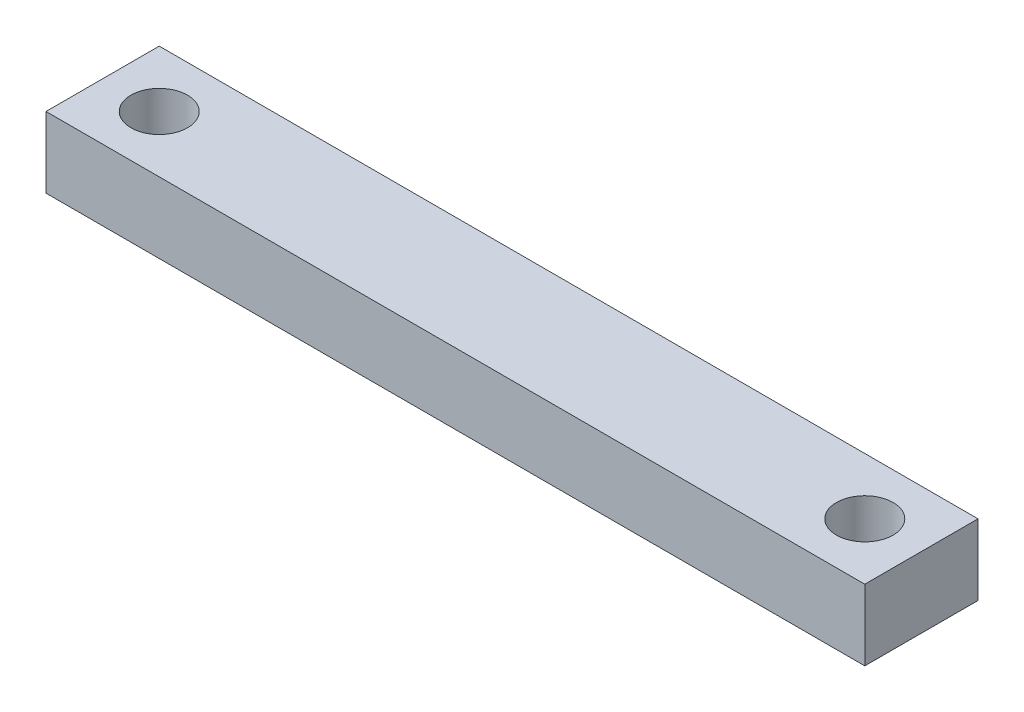
ISO-10303-21;
HEADER;
FILE_DESCRIPTION(('STEP AP214'),'2;1');
FILE_NAME('part.step','',(''),(''),'','','');
FILE_SCHEMA(('AUTOMOTIVE_DESIGN { 1 0 10303 214 1 1 1 1 }'));
ENDSEC;
DATA;
#1=APPLICATION_CONTEXT('core data for automotive mechanical design processes');
#2=APPLICATION_PROTOCOL_DEFINITION('international standard','automotive_design',2000,#1);
#3=PRODUCT_CONTEXT('',#1,'mechanical');
#4=PRODUCT('Part','Part','',(#3));
#5=PRODUCT_RELATED_PRODUCT_CATEGORY('part','',(#4));
#6=PRODUCT_DEFINITION_FORMATION('','',#4);
#7=PRODUCT_DEFINITION_CONTEXT('part definition',#1,'design');
#8=PRODUCT_DEFINITION('design','',#6,#7);
#9=PRODUCT_DEFINITION_SHAPE('','',#8);
#10=(LENGTH_UNIT() NAMED_UNIT(*) SI_UNIT(.MILLI.,.METRE.));
#11=(NAMED_UNIT(*) PLANE_ANGLE_UNIT() SI_UNIT($,.RADIAN.));
#12=(NAMED_UNIT(*) SI_UNIT($,.STERADIAN.) SOLID_ANGLE_UNIT());
#13=UNCERTAINTY_MEASURE_WITH_UNIT(LENGTH_MEASURE(1.E-05),#10,'distance_accuracy_value','');
#14=(GEOMETRIC_REPRESENTATION_CONTEXT(3) GLOBAL_UNCERTAINTY_ASSIGNED_CONTEXT((#13)) GLOBAL_UNIT_ASSIGNED_CONTEXT((#10,
#11,#12)) REPRESENTATION_CONTEXT('',''));
#15=CARTESIAN_POINT('',(0.,0.,0.));
#16=DIRECTION('',(0.,0.,1.));
#17=DIRECTION('',(1.,0.,0.));
#18=AXIS2_PLACEMENT_3D('',#15,#16,#17);
#19=CARTESIAN_POINT('',(0.,5.,0.));
#20=DIRECTION('',(0.,-1.,0.));
#21=DIRECTION('',(0.,0.,-1.));
#22=AXIS2_PLACEMENT_3D('',#19,#20,#21);
#23=PLANE('',#22);
#24=DIRECTION('',(0.,0.,1.));
#25=VECTOR('',#24,1.);
#26=CARTESIAN_POINT('',(0.,5.,0.));
#27=LINE('',#26,#25);
#28=CARTESIAN_POINT('',(0.,5.,-8.));
#29=VERTEX_POINT('',#28);
#30=CARTESIAN_POINT('',(0.,5.,0.));
#31=VERTEX_POINT('',#30);
#32=EDGE_CURVE('E89',#29,#31,#27,.T.);
#33=ORIENTED_EDGE('',*,*,#32,.T.);
#34=DIRECTION('',(1.,0.,0.));
#35=VECTOR('',#34,1.);
#36=CARTESIAN_POINT('',(0.,5.,0.));
#37=LINE('',#36,#35);
#38=CARTESIAN_POINT('',(57.85,5.,0.));
#39=VERTEX_POINT('',#38);
#40=EDGE_CURVE('E84',#31,#39,#37,.T.);
#41=ORIENTED_EDGE('',*,*,#40,.T.);
#42=DIRECTION('',(0.,0.,-1.));
#43=VECTOR('',#42,1.);
#44=CARTESIAN_POINT('',(57.85,5.,0.));
#45=LINE('',#44,#43);
#46=CARTESIAN_POINT('',(57.85,5.,-8.));
#47=VERTEX_POINT('',#46);
#48=EDGE_CURVE('E87',#39,#47,#45,.T.);
#49=ORIENTED_EDGE('',*,*,#48,.T.);
#50=DIRECTION('',(-1.,0.,0.));
#51=VECTOR('',#50,1.);
#52=CARTESIAN_POINT('',(0.,5.,-8.));
#53=LINE('',#52,#51);
#54=EDGE_CURVE('E54',#47,#29,#53,.T.);
#55=ORIENTED_EDGE('',*,*,#54,.T.);
#56=EDGE_LOOP('',(#33,#41,#49,#55));
#57=FACE_BOUND('',#56,.T.);
#58=CARTESIAN_POINT('',(4.,5.,-4.));
#59=DIRECTION('',(0.,1.,0.));
#60=DIRECTION('',(0.,0.,1.));
#61=AXIS2_PLACEMENT_3D('',#58,#59,#60);
#62=CIRCLE('',#61,2.);
#63=CARTESIAN_POINT('',(4.,5.,-2.));
#64=VERTEX_POINT('',#63);
#65=EDGE_CURVE('E104',#64,#64,#62,.T.);
#66=ORIENTED_EDGE('',*,*,#65,.F.);
#67=EDGE_LOOP('',(#66));
#68=FACE_BOUND('',#67,.T.);
#69=CARTESIAN_POINT('',(53.85,5.,-4.));
#70=DIRECTION('',(0.,1.,0.));
#71=DIRECTION('',(0.,0.,1.));
#72=AXIS2_PLACEMENT_3D('',#69,#70,#71);
#73=CIRCLE('',#72,2.);
#74=CARTESIAN_POINT('',(53.85,5.,-2.));
#75=VERTEX_POINT('',#74);
#76=EDGE_CURVE('E119',#75,#75,#73,.T.);
#77=ORIENTED_EDGE('',*,*,#76,.F.);
#78=EDGE_LOOP('',(#77));
#79=FACE_BOUND('',#78,.T.);
#80=ADVANCED_FACE('F37',(#57,#68,#79),#23,.F.);
#81=CARTESIAN_POINT('',(0.,0.,0.));
#82=DIRECTION('',(0.,-1.,0.));
#83=DIRECTION('',(0.,0.,-1.));
#84=AXIS2_PLACEMENT_3D('',#81,#82,#83);
#85=PLANE('',#84);
#86=CARTESIAN_POINT('',(4.,0.,-4.));
#87=DIRECTION('',(0.,1.,0.));
#88=DIRECTION('',(0.,0.,1.));
#89=AXIS2_PLACEMENT_3D('',#86,#87,#88);
#90=CIRCLE('',#89,2.);
#91=CARTESIAN_POINT('',(4.,0.,-2.));
#92=VERTEX_POINT('',#91);
#93=EDGE_CURVE('E116',#92,#92,#90,.T.);
#94=ORIENTED_EDGE('',*,*,#93,.T.);
#95=EDGE_LOOP('',(#94));
#96=FACE_BOUND('',#95,.T.);
#97=DIRECTION('',(0.,0.,1.));
#98=VECTOR('',#97,1.);
#99=CARTESIAN_POINT('',(0.,0.,0.));
#100=LINE('',#99,#98);
#101=CARTESIAN_POINT('',(0.,0.,-8.));
#102=VERTEX_POINT('',#101);
#103=CARTESIAN_POINT('',(0.,0.,0.));
#104=VERTEX_POINT('',#103);
#105=EDGE_CURVE('E101',#102,#104,#100,.T.);
#106=ORIENTED_EDGE('',*,*,#105,.F.);
#107=DIRECTION('',(-1.,0.,0.));
#108=VECTOR('',#107,1.);
#109=CARTESIAN_POINT('',(0.,0.,-8.));
#110=LINE('',#109,#108);
#111=CARTESIAN_POINT('',(57.85,0.,-8.));
#112=VERTEX_POINT('',#111);
#113=EDGE_CURVE('E77',#112,#102,#110,.T.);
#114=ORIENTED_EDGE('',*,*,#113,.F.);
#115=DIRECTION('',(0.,0.,-1.));
#116=VECTOR('',#115,1.);
#117=CARTESIAN_POINT('',(57.85,0.,0.));
#118=LINE('',#117,#116);
#119=CARTESIAN_POINT('',(57.85,0.,0.));
#120=VERTEX_POINT('',#119);
#121=EDGE_CURVE('E71',#120,#112,#118,.T.);
#122=ORIENTED_EDGE('',*,*,#121,.F.);
#123=DIRECTION('',(1.,0.,0.));
#124=VECTOR('',#123,1.);
#125=CARTESIAN_POINT('',(0.,0.,0.));
#126=LINE('',#125,#124);
#127=EDGE_CURVE('E93',#104,#120,#126,.T.);
#128=ORIENTED_EDGE('',*,*,#127,.F.);
#129=EDGE_LOOP('',(#106,#114,#122,#128));
#130=FACE_BOUND('',#129,.T.);
#131=CARTESIAN_POINT('',(53.85,0.,-4.));
#132=DIRECTION('',(0.,1.,0.));
#133=DIRECTION('',(0.,0.,1.));
#134=AXIS2_PLACEMENT_3D('',#131,#132,#133);
#135=CIRCLE('',#134,2.);
#136=CARTESIAN_POINT('',(53.85,0.,-2.));
#137=VERTEX_POINT('',#136);
#138=EDGE_CURVE('E122',#137,#137,#135,.T.);
#139=ORIENTED_EDGE('',*,*,#138,.T.);
#140=EDGE_LOOP('',(#139));
#141=FACE_BOUND('',#140,.T.);
#142=ADVANCED_FACE('F112',(#96,#130,#141),#85,.T.);
#143=CARTESIAN_POINT('',(0.,5.,0.));
#144=DIRECTION('',(1.,0.,0.));
#145=DIRECTION('',(0.,0.,-1.));
#146=AXIS2_PLACEMENT_3D('',#143,#144,#145);
#147=PLANE('',#146);
#148=ORIENTED_EDGE('',*,*,#105,.T.);
#149=DIRECTION('',(0.,-1.,0.));
#150=VECTOR('',#149,1.);
#151=CARTESIAN_POINT('',(0.,5.,0.));
#152=LINE('',#151,#150);
#153=EDGE_CURVE('E11',#31,#104,#152,.T.);
#154=ORIENTED_EDGE('',*,*,#153,.F.);
#155=ORIENTED_EDGE('',*,*,#32,.F.);
#156=DIRECTION('',(0.,-1.,0.));
#157=VECTOR('',#156,1.);
#158=CARTESIAN_POINT('',(0.,5.,-8.));
#159=LINE('',#158,#157);
#160=EDGE_CURVE('E97',#29,#102,#159,.T.);
#161=ORIENTED_EDGE('',*,*,#160,.T.);
#162=EDGE_LOOP('',(#148,#154,#155,#161));
#163=FACE_BOUND('',#162,.T.);
#164=ADVANCED_FACE('F39',(#163),#147,.F.);
#165=CARTESIAN_POINT('',(0.,5.,0.));
#166=DIRECTION('',(0.,0.,-1.));
#167=DIRECTION('',(-1.,0.,0.));
#168=AXIS2_PLACEMENT_3D('',#165,#166,#167);
#169=PLANE('',#168);
#170=ORIENTED_EDGE('',*,*,#127,.T.);
#171=DIRECTION('',(0.,-1.,0.));
#172=VECTOR('',#171,1.);
#173=CARTESIAN_POINT('',(57.85,5.,0.));
#174=LINE('',#173,#172);
#175=EDGE_CURVE('E46',#39,#120,#174,.T.);
#176=ORIENTED_EDGE('',*,*,#175,.F.);
#177=ORIENTED_EDGE('',*,*,#40,.F.);
#178=ORIENTED_EDGE('',*,*,#153,.T.);
#179=EDGE_LOOP('',(#170,#176,#177,#178));
#180=FACE_BOUND('',#179,.T.);
#181=ADVANCED_FACE('F92',(#180),#169,.F.);
#182=CARTESIAN_POINT('',(57.85,5.,0.));
#183=DIRECTION('',(-1.,0.,0.));
#184=DIRECTION('',(0.,0.,1.));
#185=AXIS2_PLACEMENT_3D('',#182,#183,#184);
#186=PLANE('',#185);
#187=ORIENTED_EDGE('',*,*,#121,.T.);
#188=DIRECTION('',(0.,-1.,0.));
#189=VECTOR('',#188,1.);
#190=CARTESIAN_POINT('',(57.85,5.,-8.));
#191=LINE('',#190,#189);
#192=EDGE_CURVE('E94',#47,#112,#191,.T.);
#193=ORIENTED_EDGE('',*,*,#192,.F.);
#194=ORIENTED_EDGE('',*,*,#48,.F.);
#195=ORIENTED_EDGE('',*,*,#175,.T.);
#196=EDGE_LOOP('',(#187,#193,#194,#195));
#197=FACE_BOUND('',#196,.T.);
#198=ADVANCED_FACE('F95',(#197),#186,.F.);
#199=CARTESIAN_POINT('',(0.,5.,-8.));
#200=DIRECTION('',(0.,0.,1.));
#201=DIRECTION('',(1.,0.,0.));
#202=AXIS2_PLACEMENT_3D('',#199,#200,#201);
#203=PLANE('',#202);
#204=ORIENTED_EDGE('',*,*,#113,.T.);
#205=ORIENTED_EDGE('',*,*,#160,.F.);
#206=ORIENTED_EDGE('',*,*,#54,.F.);
#207=ORIENTED_EDGE('',*,*,#192,.T.);
#208=EDGE_LOOP('',(#204,#205,#206,#207));
#209=FACE_BOUND('',#208,.T.);
#210=ADVANCED_FACE('F109',(#209),#203,.F.);
#211=CARTESIAN_POINT('',(4.,5.,-4.));
#212=DIRECTION('',(0.,-1.,0.));
#213=DIRECTION('',(0.,0.,-1.));
#214=AXIS2_PLACEMENT_3D('',#211,#212,#213);
#215=CYLINDRICAL_SURFACE('',#214,2.);
#216=ORIENTED_EDGE('',*,*,#65,.T.);
#217=EDGE_LOOP('',(#216));
#218=FACE_BOUND('',#217,.T.);
#219=ORIENTED_EDGE('',*,*,#93,.F.);
#220=EDGE_LOOP('',(#219));
#221=FACE_BOUND('',#220,.T.);
#222=ADVANCED_FACE('F139',(#218,#221),#215,.F.);
#223=CARTESIAN_POINT('',(53.85,5.,-4.));
#224=DIRECTION('',(0.,-1.,0.));
#225=DIRECTION('',(0.,0.,-1.));
#226=AXIS2_PLACEMENT_3D('',#223,#224,#225);
#227=CYLINDRICAL_SURFACE('',#226,2.);
#228=ORIENTED_EDGE('',*,*,#76,.T.);
#229=EDGE_LOOP('',(#228));
#230=FACE_BOUND('',#229,.T.);
#231=ORIENTED_EDGE('',*,*,#138,.F.);
#232=EDGE_LOOP('',(#231));
#233=FACE_BOUND('',#232,.T.);
#234=ADVANCED_FACE('F128',(#230,#233),#227,.F.);
#235=CLOSED_SHELL('',(#80,#142,#164,#181,#198,#210,#222,#234));
#236=MANIFOLD_SOLID_BREP('B2',#235);
#237=ADVANCED_BREP_SHAPE_REPRESENTATION('',(#18,#236),#14);
#238=SHAPE_DEFINITION_REPRESENTATION(#9,#237);
ENDSEC;
END-ISO-10303-21;
